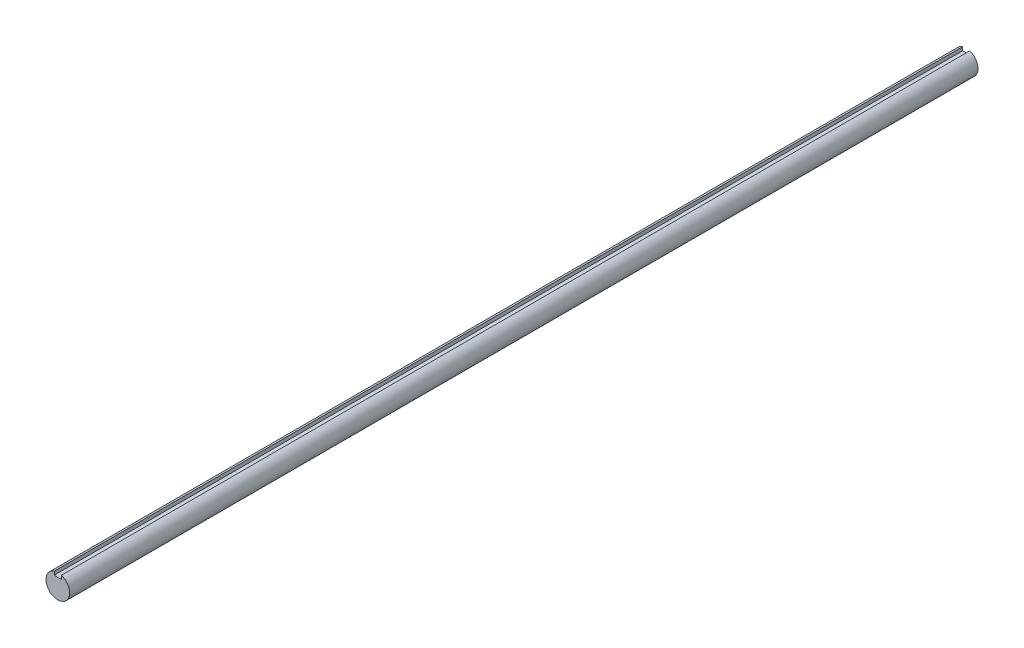
ISO-10303-21;
HEADER;
FILE_DESCRIPTION(('STEP AP214'),'2;1');
FILE_NAME('part.step','',(''),(''),'','','');
FILE_SCHEMA(('AUTOMOTIVE_DESIGN { 1 0 10303 214 1 1 1 1 }'));
ENDSEC;
DATA;
#1=APPLICATION_CONTEXT('core data for automotive mechanical design processes');
#2=APPLICATION_PROTOCOL_DEFINITION('international standard','automotive_design',2000,#1);
#3=PRODUCT_CONTEXT('',#1,'mechanical');
#4=PRODUCT('Part','Part','',(#3));
#5=PRODUCT_RELATED_PRODUCT_CATEGORY('part','',(#4));
#6=PRODUCT_DEFINITION_FORMATION('','',#4);
#7=PRODUCT_DEFINITION_CONTEXT('part definition',#1,'design');
#8=PRODUCT_DEFINITION('design','',#6,#7);
#9=PRODUCT_DEFINITION_SHAPE('','',#8);
#10=(LENGTH_UNIT() NAMED_UNIT(*) SI_UNIT(.MILLI.,.METRE.));
#11=(NAMED_UNIT(*) PLANE_ANGLE_UNIT() SI_UNIT($,.RADIAN.));
#12=(NAMED_UNIT(*) SI_UNIT($,.STERADIAN.) SOLID_ANGLE_UNIT());
#13=UNCERTAINTY_MEASURE_WITH_UNIT(LENGTH_MEASURE(1.E-05),#10,'distance_accuracy_value','');
#14=(GEOMETRIC_REPRESENTATION_CONTEXT(3) GLOBAL_UNCERTAINTY_ASSIGNED_CONTEXT((#13)) GLOBAL_UNIT_ASSIGNED_CONTEXT((#10,
#11,#12)) REPRESENTATION_CONTEXT('',''));
#15=CARTESIAN_POINT('',(0.,0.,0.));
#16=DIRECTION('',(0.,0.,1.));
#17=DIRECTION('',(1.,0.,0.));
#18=AXIS2_PLACEMENT_3D('',#15,#16,#17);
#19=CARTESIAN_POINT('',(0.,0.,-152.4));
#20=DIRECTION('',(0.,0.,1.));
#21=DIRECTION('',(1.,0.,0.));
#22=AXIS2_PLACEMENT_3D('',#19,#20,#21);
#23=CYLINDRICAL_SURFACE('',#22,3.96874999999999);
#24=DIRECTION('',(0.,0.,1.));
#25=VECTOR('',#24,1.);
#26=CARTESIAN_POINT('',(1.1938,3.78494625093936,-152.4));
#27=LINE('',#26,#25);
#28=CARTESIAN_POINT('',(1.1938,3.78494625093936,-152.4));
#29=VERTEX_POINT('',#28);
#30=CARTESIAN_POINT('',(1.1938,3.78494625093936,152.4));
#31=VERTEX_POINT('',#30);
#32=EDGE_CURVE('E36',#29,#31,#27,.T.);
#33=ORIENTED_EDGE('',*,*,#32,.T.);
#34=CARTESIAN_POINT('',(0.,0.,152.4));
#35=DIRECTION('',(0.,0.,1.));
#36=DIRECTION('',(1.,0.,0.));
#37=AXIS2_PLACEMENT_3D('',#34,#35,#36);
#38=CIRCLE('',#37,3.96874999999999);
#39=CARTESIAN_POINT('',(-1.1938,3.78494625093936,152.4));
#40=VERTEX_POINT('',#39);
#41=EDGE_CURVE('E73',#40,#31,#38,.T.);
#42=ORIENTED_EDGE('',*,*,#41,.F.);
#43=DIRECTION('',(0.,0.,1.));
#44=VECTOR('',#43,1.);
#45=CARTESIAN_POINT('',(-1.1938,3.78494625093936,-152.4));
#46=LINE('',#45,#44);
#47=CARTESIAN_POINT('',(-1.1938,3.78494625093936,-152.4));
#48=VERTEX_POINT('',#47);
#49=EDGE_CURVE('E11',#48,#40,#46,.T.);
#50=ORIENTED_EDGE('',*,*,#49,.F.);
#51=CARTESIAN_POINT('',(0.,0.,-152.4));
#52=DIRECTION('',(0.,0.,1.));
#53=DIRECTION('',(1.,0.,0.));
#54=AXIS2_PLACEMENT_3D('',#51,#52,#53);
#55=CIRCLE('',#54,3.96874999999999);
#56=EDGE_CURVE('E74',#48,#29,#55,.T.);
#57=ORIENTED_EDGE('',*,*,#56,.T.);
#58=EDGE_LOOP('',(#33,#42,#50,#57));
#59=FACE_BOUND('',#58,.T.);
#60=ADVANCED_FACE('F33',(#59),#23,.T.);
#61=CARTESIAN_POINT('',(-1.1938,2.59114625093936,-152.4));
#62=DIRECTION('',(1.,0.,0.));
#63=DIRECTION('',(0.,0.,-1.));
#64=AXIS2_PLACEMENT_3D('',#61,#62,#63);
#65=PLANE('',#64);
#66=ORIENTED_EDGE('',*,*,#49,.T.);
#67=DIRECTION('',(0.,1.,0.));
#68=VECTOR('',#67,1.);
#69=CARTESIAN_POINT('',(-1.1938,2.59114625093936,152.4));
#70=LINE('',#69,#68);
#71=CARTESIAN_POINT('',(-1.1938,2.59114625093936,152.4));
#72=VERTEX_POINT('',#71);
#73=EDGE_CURVE('E90',#72,#40,#70,.T.);
#74=ORIENTED_EDGE('',*,*,#73,.F.);
#75=DIRECTION('',(0.,0.,1.));
#76=VECTOR('',#75,1.);
#77=CARTESIAN_POINT('',(-1.1938,2.59114625093936,-152.4));
#78=LINE('',#77,#76);
#79=CARTESIAN_POINT('',(-1.1938,2.59114625093936,-152.4));
#80=VERTEX_POINT('',#79);
#81=EDGE_CURVE('E41',#80,#72,#78,.T.);
#82=ORIENTED_EDGE('',*,*,#81,.F.);
#83=DIRECTION('',(0.,1.,0.));
#84=VECTOR('',#83,1.);
#85=CARTESIAN_POINT('',(-1.1938,2.59114625093936,-152.4));
#86=LINE('',#85,#84);
#87=EDGE_CURVE('E79',#80,#48,#86,.T.);
#88=ORIENTED_EDGE('',*,*,#87,.T.);
#89=EDGE_LOOP('',(#66,#74,#82,#88));
#90=FACE_BOUND('',#89,.T.);
#91=ADVANCED_FACE('F105',(#90),#65,.T.);
#92=CARTESIAN_POINT('',(1.1938,2.59114625093936,-152.4));
#93=DIRECTION('',(0.,1.,0.));
#94=DIRECTION('',(0.,0.,1.));
#95=AXIS2_PLACEMENT_3D('',#92,#93,#94);
#96=PLANE('',#95);
#97=ORIENTED_EDGE('',*,*,#81,.T.);
#98=DIRECTION('',(-1.,0.,0.));
#99=VECTOR('',#98,1.);
#100=CARTESIAN_POINT('',(1.1938,2.59114625093936,152.4));
#101=LINE('',#100,#99);
#102=CARTESIAN_POINT('',(1.1938,2.59114625093936,152.4));
#103=VERTEX_POINT('',#102);
#104=EDGE_CURVE('E86',#103,#72,#101,.T.);
#105=ORIENTED_EDGE('',*,*,#104,.F.);
#106=DIRECTION('',(0.,0.,1.));
#107=VECTOR('',#106,1.);
#108=CARTESIAN_POINT('',(1.1938,2.59114625093936,-152.4));
#109=LINE('',#108,#107);
#110=CARTESIAN_POINT('',(1.1938,2.59114625093936,-152.4));
#111=VERTEX_POINT('',#110);
#112=EDGE_CURVE('E78',#111,#103,#109,.T.);
#113=ORIENTED_EDGE('',*,*,#112,.F.);
#114=DIRECTION('',(-1.,0.,0.));
#115=VECTOR('',#114,1.);
#116=CARTESIAN_POINT('',(1.1938,2.59114625093936,-152.4));
#117=LINE('',#116,#115);
#118=EDGE_CURVE('E98',#111,#80,#117,.T.);
#119=ORIENTED_EDGE('',*,*,#118,.T.);
#120=EDGE_LOOP('',(#97,#105,#113,#119));
#121=FACE_BOUND('',#120,.T.);
#122=ADVANCED_FACE('F102',(#121),#96,.T.);
#123=CARTESIAN_POINT('',(1.1938,2.59114625093936,-152.4));
#124=DIRECTION('',(-1.,0.,0.));
#125=DIRECTION('',(0.,0.,1.));
#126=AXIS2_PLACEMENT_3D('',#123,#124,#125);
#127=PLANE('',#126);
#128=ORIENTED_EDGE('',*,*,#112,.T.);
#129=DIRECTION('',(0.,-1.,0.));
#130=VECTOR('',#129,1.);
#131=CARTESIAN_POINT('',(1.1938,2.59114625093936,152.4));
#132=LINE('',#131,#130);
#133=EDGE_CURVE('E81',#31,#103,#132,.T.);
#134=ORIENTED_EDGE('',*,*,#133,.F.);
#135=ORIENTED_EDGE('',*,*,#32,.F.);
#136=DIRECTION('',(0.,-1.,0.));
#137=VECTOR('',#136,1.);
#138=CARTESIAN_POINT('',(1.1938,2.59114625093936,-152.4));
#139=LINE('',#138,#137);
#140=EDGE_CURVE('E96',#29,#111,#139,.T.);
#141=ORIENTED_EDGE('',*,*,#140,.T.);
#142=EDGE_LOOP('',(#128,#134,#135,#141));
#143=FACE_BOUND('',#142,.T.);
#144=ADVANCED_FACE('F82',(#143),#127,.T.);
#145=CARTESIAN_POINT('',(0.,0.,-152.4));
#146=DIRECTION('',(0.,0.,1.));
#147=DIRECTION('',(1.,0.,0.));
#148=AXIS2_PLACEMENT_3D('',#145,#146,#147);
#149=PLANE('',#148);
#150=ORIENTED_EDGE('',*,*,#56,.F.);
#151=ORIENTED_EDGE('',*,*,#87,.F.);
#152=ORIENTED_EDGE('',*,*,#118,.F.);
#153=ORIENTED_EDGE('',*,*,#140,.F.);
#154=EDGE_LOOP('',(#150,#151,#152,#153));
#155=FACE_BOUND('',#154,.T.);
#156=ADVANCED_FACE('F107',(#155),#149,.F.);
#157=CARTESIAN_POINT('',(0.,0.,152.4));
#158=DIRECTION('',(0.,0.,1.));
#159=DIRECTION('',(1.,0.,0.));
#160=AXIS2_PLACEMENT_3D('',#157,#158,#159);
#161=PLANE('',#160);
#162=ORIENTED_EDGE('',*,*,#41,.T.);
#163=ORIENTED_EDGE('',*,*,#133,.T.);
#164=ORIENTED_EDGE('',*,*,#104,.T.);
#165=ORIENTED_EDGE('',*,*,#73,.T.);
#166=EDGE_LOOP('',(#162,#163,#164,#165));
#167=FACE_BOUND('',#166,.T.);
#168=ADVANCED_FACE('F89',(#167),#161,.T.);
#169=CLOSED_SHELL('',(#60,#91,#122,#144,#156,#168));
#170=MANIFOLD_SOLID_BREP('B2',#169);
#171=ADVANCED_BREP_SHAPE_REPRESENTATION('',(#18,#170),#14);
#172=SHAPE_DEFINITION_REPRESENTATION(#9,#171);
ENDSEC;
END-ISO-10303-21;
